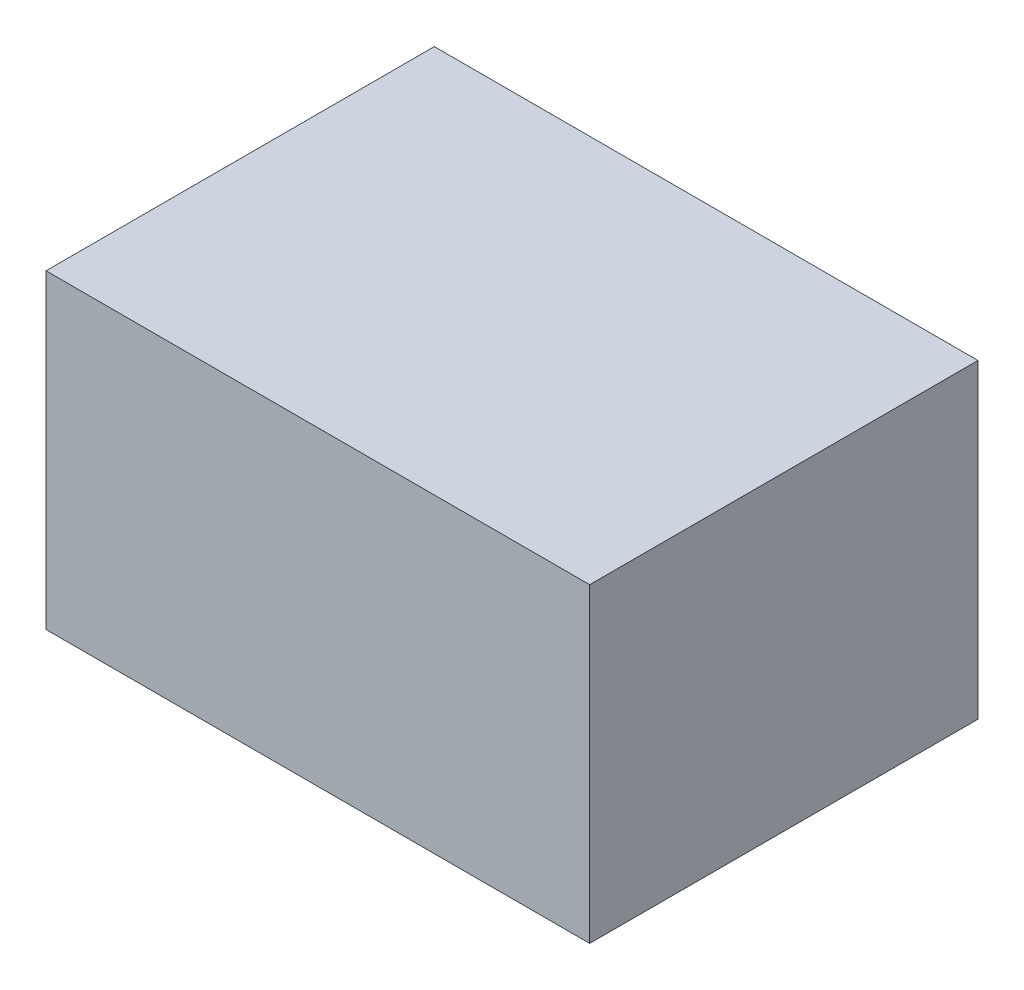
ISO-10303-21;
HEADER;
FILE_DESCRIPTION(('STEP AP214'),'2;1');
FILE_NAME('part.step','',(''),(''),'','','');
FILE_SCHEMA(('AUTOMOTIVE_DESIGN { 1 0 10303 214 1 1 1 1 }'));
ENDSEC;
DATA;
#1=APPLICATION_CONTEXT('core data for automotive mechanical design processes');
#2=APPLICATION_PROTOCOL_DEFINITION('international standard','automotive_design',2000,#1);
#3=PRODUCT_CONTEXT('',#1,'mechanical');
#4=PRODUCT('Part','Part','',(#3));
#5=PRODUCT_RELATED_PRODUCT_CATEGORY('part','',(#4));
#6=PRODUCT_DEFINITION_FORMATION('','',#4);
#7=PRODUCT_DEFINITION_CONTEXT('part definition',#1,'design');
#8=PRODUCT_DEFINITION('design','',#6,#7);
#9=PRODUCT_DEFINITION_SHAPE('','',#8);
#10=(LENGTH_UNIT() NAMED_UNIT(*) SI_UNIT(.MILLI.,.METRE.));
#11=(NAMED_UNIT(*) PLANE_ANGLE_UNIT() SI_UNIT($,.RADIAN.));
#12=(NAMED_UNIT(*) SI_UNIT($,.STERADIAN.) SOLID_ANGLE_UNIT());
#13=UNCERTAINTY_MEASURE_WITH_UNIT(LENGTH_MEASURE(1.E-05),#10,'distance_accuracy_value','');
#14=(GEOMETRIC_REPRESENTATION_CONTEXT(3) GLOBAL_UNCERTAINTY_ASSIGNED_CONTEXT((#13)) GLOBAL_UNIT_ASSIGNED_CONTEXT((#10,
#11,#12)) REPRESENTATION_CONTEXT('',''));
#15=CARTESIAN_POINT('',(0.,0.,0.));
#16=DIRECTION('',(0.,0.,1.));
#17=DIRECTION('',(1.,0.,0.));
#18=AXIS2_PLACEMENT_3D('',#15,#16,#17);
#19=CARTESIAN_POINT('',(0.,80.,0.));
#20=DIRECTION('',(1.,0.,0.));
#21=DIRECTION('',(0.,0.,-1.));
#22=AXIS2_PLACEMENT_3D('',#19,#20,#21);
#23=PLANE('',#22);
#24=DIRECTION('',(0.,0.,1.));
#25=VECTOR('',#24,1.);
#26=CARTESIAN_POINT('',(0.,0.,0.));
#27=LINE('',#26,#25);
#28=CARTESIAN_POINT('',(0.,0.,-100.));
#29=VERTEX_POINT('',#28);
#30=CARTESIAN_POINT('',(0.,0.,0.));
#31=VERTEX_POINT('',#30);
#32=EDGE_CURVE('E103',#29,#31,#27,.T.);
#33=ORIENTED_EDGE('',*,*,#32,.T.);
#34=DIRECTION('',(0.,-1.,0.));
#35=VECTOR('',#34,1.);
#36=CARTESIAN_POINT('',(0.,80.,0.));
#37=LINE('',#36,#35);
#38=CARTESIAN_POINT('',(0.,80.,0.));
#39=VERTEX_POINT('',#38);
#40=EDGE_CURVE('E11',#39,#31,#37,.T.);
#41=ORIENTED_EDGE('',*,*,#40,.F.);
#42=DIRECTION('',(0.,0.,1.));
#43=VECTOR('',#42,1.);
#44=CARTESIAN_POINT('',(0.,80.,0.));
#45=LINE('',#44,#43);
#46=CARTESIAN_POINT('',(0.,80.,-100.));
#47=VERTEX_POINT('',#46);
#48=EDGE_CURVE('E91',#47,#39,#45,.T.);
#49=ORIENTED_EDGE('',*,*,#48,.F.);
#50=DIRECTION('',(0.,-1.,0.));
#51=VECTOR('',#50,1.);
#52=CARTESIAN_POINT('',(0.,80.,-100.));
#53=LINE('',#52,#51);
#54=EDGE_CURVE('E99',#47,#29,#53,.T.);
#55=ORIENTED_EDGE('',*,*,#54,.T.);
#56=EDGE_LOOP('',(#33,#41,#49,#55));
#57=FACE_BOUND('',#56,.T.);
#58=ADVANCED_FACE('F40',(#57),#23,.F.);
#59=CARTESIAN_POINT('',(0.,80.,0.));
#60=DIRECTION('',(0.,0.,-1.));
#61=DIRECTION('',(-1.,0.,0.));
#62=AXIS2_PLACEMENT_3D('',#59,#60,#61);
#63=PLANE('',#62);
#64=DIRECTION('',(1.,0.,0.));
#65=VECTOR('',#64,1.);
#66=CARTESIAN_POINT('',(0.,0.,0.));
#67=LINE('',#66,#65);
#68=CARTESIAN_POINT('',(140.,0.,0.));
#69=VERTEX_POINT('',#68);
#70=EDGE_CURVE('E95',#31,#69,#67,.T.);
#71=ORIENTED_EDGE('',*,*,#70,.T.);
#72=DIRECTION('',(0.,-1.,0.));
#73=VECTOR('',#72,1.);
#74=CARTESIAN_POINT('',(140.,80.,0.));
#75=LINE('',#74,#73);
#76=CARTESIAN_POINT('',(140.,80.,0.));
#77=VERTEX_POINT('',#76);
#78=EDGE_CURVE('E48',#77,#69,#75,.T.);
#79=ORIENTED_EDGE('',*,*,#78,.F.);
#80=DIRECTION('',(1.,0.,0.));
#81=VECTOR('',#80,1.);
#82=CARTESIAN_POINT('',(0.,80.,0.));
#83=LINE('',#82,#81);
#84=EDGE_CURVE('E86',#39,#77,#83,.T.);
#85=ORIENTED_EDGE('',*,*,#84,.F.);
#86=ORIENTED_EDGE('',*,*,#40,.T.);
#87=EDGE_LOOP('',(#71,#79,#85,#86));
#88=FACE_BOUND('',#87,.T.);
#89=ADVANCED_FACE('F94',(#88),#63,.F.);
#90=CARTESIAN_POINT('',(140.,80.,0.));
#91=DIRECTION('',(-1.,0.,0.));
#92=DIRECTION('',(0.,0.,1.));
#93=AXIS2_PLACEMENT_3D('',#90,#91,#92);
#94=PLANE('',#93);
#95=DIRECTION('',(0.,0.,-1.));
#96=VECTOR('',#95,1.);
#97=CARTESIAN_POINT('',(140.,0.,0.));
#98=LINE('',#97,#96);
#99=CARTESIAN_POINT('',(140.,0.,-100.));
#100=VERTEX_POINT('',#99);
#101=EDGE_CURVE('E73',#69,#100,#98,.T.);
#102=ORIENTED_EDGE('',*,*,#101,.T.);
#103=DIRECTION('',(0.,-1.,0.));
#104=VECTOR('',#103,1.);
#105=CARTESIAN_POINT('',(140.,80.,-100.));
#106=LINE('',#105,#104);
#107=CARTESIAN_POINT('',(140.,80.,-100.));
#108=VERTEX_POINT('',#107);
#109=EDGE_CURVE('E96',#108,#100,#106,.T.);
#110=ORIENTED_EDGE('',*,*,#109,.F.);
#111=DIRECTION('',(0.,0.,-1.));
#112=VECTOR('',#111,1.);
#113=CARTESIAN_POINT('',(140.,80.,0.));
#114=LINE('',#113,#112);
#115=EDGE_CURVE('E89',#77,#108,#114,.T.);
#116=ORIENTED_EDGE('',*,*,#115,.F.);
#117=ORIENTED_EDGE('',*,*,#78,.T.);
#118=EDGE_LOOP('',(#102,#110,#116,#117));
#119=FACE_BOUND('',#118,.T.);
#120=ADVANCED_FACE('F97',(#119),#94,.F.);
#121=CARTESIAN_POINT('',(0.,80.,-100.));
#122=DIRECTION('',(0.,0.,1.));
#123=DIRECTION('',(1.,0.,0.));
#124=AXIS2_PLACEMENT_3D('',#121,#122,#123);
#125=PLANE('',#124);
#126=DIRECTION('',(-1.,0.,0.));
#127=VECTOR('',#126,1.);
#128=CARTESIAN_POINT('',(0.,0.,-100.));
#129=LINE('',#128,#127);
#130=EDGE_CURVE('E79',#100,#29,#129,.T.);
#131=ORIENTED_EDGE('',*,*,#130,.T.);
#132=ORIENTED_EDGE('',*,*,#54,.F.);
#133=DIRECTION('',(-1.,0.,0.));
#134=VECTOR('',#133,1.);
#135=CARTESIAN_POINT('',(0.,80.,-100.));
#136=LINE('',#135,#134);
#137=EDGE_CURVE('E56',#108,#47,#136,.T.);
#138=ORIENTED_EDGE('',*,*,#137,.F.);
#139=ORIENTED_EDGE('',*,*,#109,.T.);
#140=EDGE_LOOP('',(#131,#132,#138,#139));
#141=FACE_BOUND('',#140,.T.);
#142=ADVANCED_FACE('F110',(#141),#125,.F.);
#143=CARTESIAN_POINT('',(0.,80.,0.));
#144=DIRECTION('',(0.,-1.,0.));
#145=DIRECTION('',(0.,0.,-1.));
#146=AXIS2_PLACEMENT_3D('',#143,#144,#145);
#147=PLANE('',#146);
#148=ORIENTED_EDGE('',*,*,#48,.T.);
#149=ORIENTED_EDGE('',*,*,#84,.T.);
#150=ORIENTED_EDGE('',*,*,#115,.T.);
#151=ORIENTED_EDGE('',*,*,#137,.T.);
#152=EDGE_LOOP('',(#148,#149,#150,#151));
#153=FACE_BOUND('',#152,.T.);
#154=ADVANCED_FACE('F87',(#153),#147,.F.);
#155=CARTESIAN_POINT('',(0.,0.,0.));
#156=DIRECTION('',(0.,-1.,0.));
#157=DIRECTION('',(0.,0.,-1.));
#158=AXIS2_PLACEMENT_3D('',#155,#156,#157);
#159=PLANE('',#158);
#160=ORIENTED_EDGE('',*,*,#32,.F.);
#161=ORIENTED_EDGE('',*,*,#130,.F.);
#162=ORIENTED_EDGE('',*,*,#101,.F.);
#163=ORIENTED_EDGE('',*,*,#70,.F.);
#164=EDGE_LOOP('',(#160,#161,#162,#163));
#165=FACE_BOUND('',#164,.T.);
#166=ADVANCED_FACE('F113',(#165),#159,.T.);
#167=CLOSED_SHELL('',(#58,#89,#120,#142,#154,#166));
#168=MANIFOLD_SOLID_BREP('B2',#167);
#169=ADVANCED_BREP_SHAPE_REPRESENTATION('',(#18,#168),#14);
#170=SHAPE_DEFINITION_REPRESENTATION(#9,#169);
ENDSEC;
END-ISO-10303-21;
